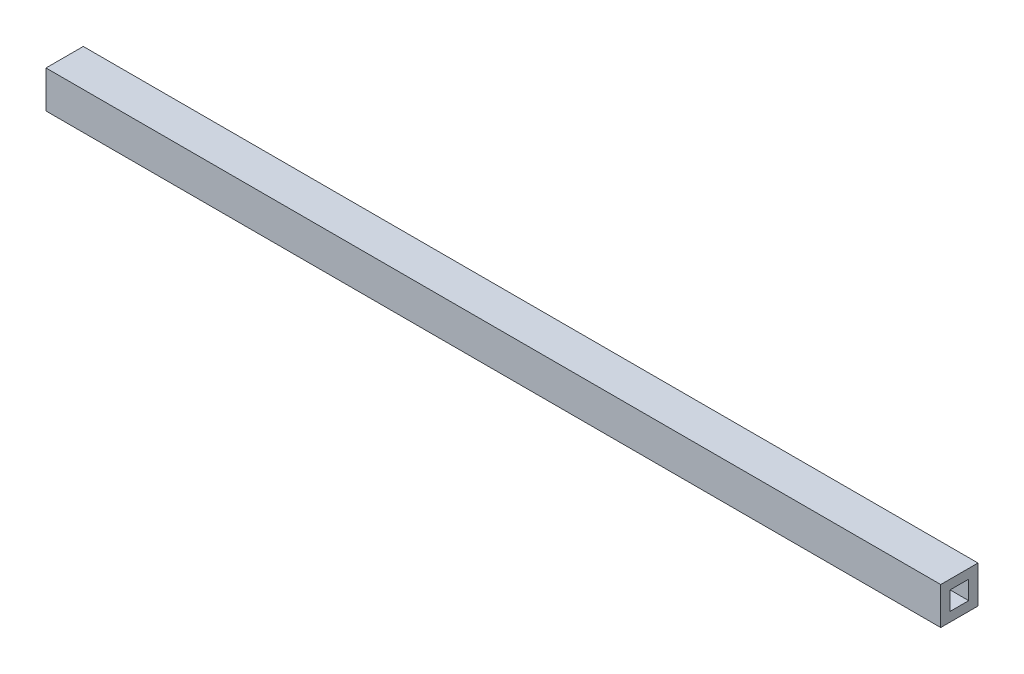
ISO-10303-21;
HEADER;
FILE_DESCRIPTION(('STEP AP214'),'2;1');
FILE_NAME('part.step','',(''),(''),'','','');
FILE_SCHEMA(('AUTOMOTIVE_DESIGN { 1 0 10303 214 1 1 1 1 }'));
ENDSEC;
DATA;
#1=APPLICATION_CONTEXT('core data for automotive mechanical design processes');
#2=APPLICATION_PROTOCOL_DEFINITION('international standard','automotive_design',2000,#1);
#3=PRODUCT_CONTEXT('',#1,'mechanical');
#4=PRODUCT('Part','Part','',(#3));
#5=PRODUCT_RELATED_PRODUCT_CATEGORY('part','',(#4));
#6=PRODUCT_DEFINITION_FORMATION('','',#4);
#7=PRODUCT_DEFINITION_CONTEXT('part definition',#1,'design');
#8=PRODUCT_DEFINITION('design','',#6,#7);
#9=PRODUCT_DEFINITION_SHAPE('','',#8);
#10=(LENGTH_UNIT() NAMED_UNIT(*) SI_UNIT(.MILLI.,.METRE.));
#11=(NAMED_UNIT(*) PLANE_ANGLE_UNIT() SI_UNIT($,.RADIAN.));
#12=(NAMED_UNIT(*) SI_UNIT($,.STERADIAN.) SOLID_ANGLE_UNIT());
#13=UNCERTAINTY_MEASURE_WITH_UNIT(LENGTH_MEASURE(1.E-05),#10,'distance_accuracy_value','');
#14=(GEOMETRIC_REPRESENTATION_CONTEXT(3) GLOBAL_UNCERTAINTY_ASSIGNED_CONTEXT((#13)) GLOBAL_UNIT_ASSIGNED_CONTEXT((#10,
#11,#12)) REPRESENTATION_CONTEXT('',''));
#15=CARTESIAN_POINT('',(0.,0.,0.));
#16=DIRECTION('',(0.,0.,1.));
#17=DIRECTION('',(1.,0.,0.));
#18=AXIS2_PLACEMENT_3D('',#15,#16,#17);
#19=CARTESIAN_POINT('',(-304.800000000001,-12.7,25.4));
#20=DIRECTION('',(1.,0.,0.));
#21=DIRECTION('',(0.,0.,-1.));
#22=AXIS2_PLACEMENT_3D('',#19,#20,#21);
#23=PLANE('',#22);
#24=DIRECTION('',(0.,0.,1.));
#25=VECTOR('',#24,1.);
#26=CARTESIAN_POINT('',(-304.800000000001,6.35,6.32894550076037));
#27=LINE('',#26,#25);
#28=CARTESIAN_POINT('',(-304.800000000001,6.35,6.32894550076037));
#29=VERTEX_POINT('',#28);
#30=CARTESIAN_POINT('',(-304.800000000001,6.35,19.0710544992396));
#31=VERTEX_POINT('',#30);
#32=EDGE_CURVE('E105',#29,#31,#27,.T.);
#33=ORIENTED_EDGE('',*,*,#32,.T.);
#34=DIRECTION('',(0.,-1.,0.));
#35=VECTOR('',#34,1.);
#36=CARTESIAN_POINT('',(-304.800000000001,-6.35,19.0710544992396));
#37=LINE('',#36,#35);
#38=CARTESIAN_POINT('',(-304.800000000001,-6.35,19.0710544992396));
#39=VERTEX_POINT('',#38);
#40=EDGE_CURVE('E99',#31,#39,#37,.T.);
#41=ORIENTED_EDGE('',*,*,#40,.T.);
#42=DIRECTION('',(0.,0.,-1.));
#43=VECTOR('',#42,1.);
#44=CARTESIAN_POINT('',(-304.800000000001,-6.35,6.32894550076037));
#45=LINE('',#44,#43);
#46=CARTESIAN_POINT('',(-304.800000000001,-6.35,6.32894550076037));
#47=VERTEX_POINT('',#46);
#48=EDGE_CURVE('E108',#39,#47,#45,.T.);
#49=ORIENTED_EDGE('',*,*,#48,.T.);
#50=DIRECTION('',(0.,1.,0.));
#51=VECTOR('',#50,1.);
#52=CARTESIAN_POINT('',(-304.800000000001,-6.35,6.32894550076037));
#53=LINE('',#52,#51);
#54=EDGE_CURVE('E47',#47,#29,#53,.T.);
#55=ORIENTED_EDGE('',*,*,#54,.T.);
#56=EDGE_LOOP('',(#33,#41,#49,#55));
#57=FACE_BOUND('',#56,.T.);
#58=DIRECTION('',(0.,-1.,0.));
#59=VECTOR('',#58,1.);
#60=CARTESIAN_POINT('',(-304.800000000001,-12.7,0.));
#61=LINE('',#60,#59);
#62=CARTESIAN_POINT('',(-304.800000000001,12.7,0.));
#63=VERTEX_POINT('',#62);
#64=CARTESIAN_POINT('',(-304.800000000001,-12.7,0.));
#65=VERTEX_POINT('',#64);
#66=EDGE_CURVE('E129',#63,#65,#61,.T.);
#67=ORIENTED_EDGE('',*,*,#66,.T.);
#68=DIRECTION('',(0.,0.,-1.));
#69=VECTOR('',#68,1.);
#70=CARTESIAN_POINT('',(-304.800000000001,-12.7,25.4));
#71=LINE('',#70,#69);
#72=CARTESIAN_POINT('',(-304.800000000001,-12.7,25.4));
#73=VERTEX_POINT('',#72);
#74=EDGE_CURVE('E11',#73,#65,#71,.T.);
#75=ORIENTED_EDGE('',*,*,#74,.F.);
#76=DIRECTION('',(0.,-1.,0.));
#77=VECTOR('',#76,1.);
#78=CARTESIAN_POINT('',(-304.800000000001,-12.7,25.4));
#79=LINE('',#78,#77);
#80=CARTESIAN_POINT('',(-304.800000000001,12.7,25.4));
#81=VERTEX_POINT('',#80);
#82=EDGE_CURVE('E133',#81,#73,#79,.T.);
#83=ORIENTED_EDGE('',*,*,#82,.F.);
#84=DIRECTION('',(0.,0.,-1.));
#85=VECTOR('',#84,1.);
#86=CARTESIAN_POINT('',(-304.800000000001,12.7,25.4));
#87=LINE('',#86,#85);
#88=EDGE_CURVE('E143',#81,#63,#87,.T.);
#89=ORIENTED_EDGE('',*,*,#88,.T.);
#90=EDGE_LOOP('',(#67,#75,#83,#89));
#91=FACE_BOUND('',#90,.T.);
#92=ADVANCED_FACE('F33',(#57,#91),#23,.F.);
#93=CARTESIAN_POINT('',(304.799999999999,-12.6999999999999,25.4));
#94=DIRECTION('',(0.,1.,0.));
#95=DIRECTION('',(-1.,0.,0.));
#96=AXIS2_PLACEMENT_3D('',#93,#94,#95);
#97=PLANE('',#96);
#98=DIRECTION('',(1.,0.,0.));
#99=VECTOR('',#98,1.);
#100=CARTESIAN_POINT('',(304.799999999999,-12.6999999999999,0.));
#101=LINE('',#100,#99);
#102=CARTESIAN_POINT('',(304.799999999999,-12.6999999999999,0.));
#103=VERTEX_POINT('',#102);
#104=EDGE_CURVE('E146',#65,#103,#101,.T.);
#105=ORIENTED_EDGE('',*,*,#104,.T.);
#106=DIRECTION('',(0.,0.,-1.));
#107=VECTOR('',#106,1.);
#108=CARTESIAN_POINT('',(304.799999999999,-12.6999999999999,25.4));
#109=LINE('',#108,#107);
#110=CARTESIAN_POINT('',(304.799999999999,-12.6999999999999,25.4));
#111=VERTEX_POINT('',#110);
#112=EDGE_CURVE('E40',#111,#103,#109,.T.);
#113=ORIENTED_EDGE('',*,*,#112,.F.);
#114=DIRECTION('',(1.,0.,0.));
#115=VECTOR('',#114,1.);
#116=CARTESIAN_POINT('',(304.799999999999,-12.6999999999999,25.4));
#117=LINE('',#116,#115);
#118=EDGE_CURVE('E136',#73,#111,#117,.T.);
#119=ORIENTED_EDGE('',*,*,#118,.F.);
#120=ORIENTED_EDGE('',*,*,#74,.T.);
#121=EDGE_LOOP('',(#105,#113,#119,#120));
#122=FACE_BOUND('',#121,.T.);
#123=ADVANCED_FACE('F175',(#122),#97,.F.);
#124=CARTESIAN_POINT('',(304.799999999999,-12.6999999999999,25.4));
#125=DIRECTION('',(-1.,0.,0.));
#126=DIRECTION('',(0.,0.,1.));
#127=AXIS2_PLACEMENT_3D('',#124,#125,#126);
#128=PLANE('',#127);
#129=DIRECTION('',(0.,0.,-1.));
#130=VECTOR('',#129,1.);
#131=CARTESIAN_POINT('',(304.799999999999,-6.35,6.32894550076037));
#132=LINE('',#131,#130);
#133=CARTESIAN_POINT('',(304.799999999999,-6.35,19.0710544992396));
#134=VERTEX_POINT('',#133);
#135=CARTESIAN_POINT('',(304.799999999999,-6.35,6.32894550076037));
#136=VERTEX_POINT('',#135);
#137=EDGE_CURVE('E123',#134,#136,#132,.T.);
#138=ORIENTED_EDGE('',*,*,#137,.F.);
#139=DIRECTION('',(0.,-1.,0.));
#140=VECTOR('',#139,1.);
#141=CARTESIAN_POINT('',(304.799999999999,-6.35,19.0710544992396));
#142=LINE('',#141,#140);
#143=CARTESIAN_POINT('',(304.799999999999,6.35,19.0710544992396));
#144=VERTEX_POINT('',#143);
#145=EDGE_CURVE('E55',#144,#134,#142,.T.);
#146=ORIENTED_EDGE('',*,*,#145,.F.);
#147=DIRECTION('',(0.,0.,1.));
#148=VECTOR('',#147,1.);
#149=CARTESIAN_POINT('',(304.799999999999,6.35,6.32894550076037));
#150=LINE('',#149,#148);
#151=CARTESIAN_POINT('',(304.799999999999,6.35,6.32894550076037));
#152=VERTEX_POINT('',#151);
#153=EDGE_CURVE('E114',#152,#144,#150,.T.);
#154=ORIENTED_EDGE('',*,*,#153,.F.);
#155=DIRECTION('',(0.,1.,0.));
#156=VECTOR('',#155,1.);
#157=CARTESIAN_POINT('',(304.799999999999,-6.35,6.32894550076037));
#158=LINE('',#157,#156);
#159=EDGE_CURVE('E117',#136,#152,#158,.T.);
#160=ORIENTED_EDGE('',*,*,#159,.F.);
#161=EDGE_LOOP('',(#138,#146,#154,#160));
#162=FACE_BOUND('',#161,.T.);
#163=DIRECTION('',(0.,1.,0.));
#164=VECTOR('',#163,1.);
#165=CARTESIAN_POINT('',(304.799999999999,-12.6999999999999,0.));
#166=LINE('',#165,#164);
#167=CARTESIAN_POINT('',(304.799999999999,12.7000000000001,0.));
#168=VERTEX_POINT('',#167);
#169=EDGE_CURVE('E148',#103,#168,#166,.T.);
#170=ORIENTED_EDGE('',*,*,#169,.T.);
#171=DIRECTION('',(0.,0.,-1.));
#172=VECTOR('',#171,1.);
#173=CARTESIAN_POINT('',(304.799999999999,12.7000000000001,25.4));
#174=LINE('',#173,#172);
#175=CARTESIAN_POINT('',(304.799999999999,12.7000000000001,25.4));
#176=VERTEX_POINT('',#175);
#177=EDGE_CURVE('E153',#176,#168,#174,.T.);
#178=ORIENTED_EDGE('',*,*,#177,.F.);
#179=DIRECTION('',(0.,1.,0.));
#180=VECTOR('',#179,1.);
#181=CARTESIAN_POINT('',(304.799999999999,-12.6999999999999,25.4));
#182=LINE('',#181,#180);
#183=EDGE_CURVE('E139',#111,#176,#182,.T.);
#184=ORIENTED_EDGE('',*,*,#183,.F.);
#185=ORIENTED_EDGE('',*,*,#112,.T.);
#186=EDGE_LOOP('',(#170,#178,#184,#185));
#187=FACE_BOUND('',#186,.T.);
#188=ADVANCED_FACE('F160',(#162,#187),#128,.F.);
#189=CARTESIAN_POINT('',(304.799999999999,12.7000000000001,25.4));
#190=DIRECTION('',(0.,-1.,0.));
#191=DIRECTION('',(1.,0.,0.));
#192=AXIS2_PLACEMENT_3D('',#189,#190,#191);
#193=PLANE('',#192);
#194=DIRECTION('',(-1.,0.,0.));
#195=VECTOR('',#194,1.);
#196=CARTESIAN_POINT('',(304.799999999999,12.7000000000001,0.));
#197=LINE('',#196,#195);
#198=EDGE_CURVE('E137',#168,#63,#197,.T.);
#199=ORIENTED_EDGE('',*,*,#198,.T.);
#200=ORIENTED_EDGE('',*,*,#88,.F.);
#201=DIRECTION('',(-1.,0.,0.));
#202=VECTOR('',#201,1.);
#203=CARTESIAN_POINT('',(304.799999999999,12.7000000000001,25.4));
#204=LINE('',#203,#202);
#205=EDGE_CURVE('E141',#176,#81,#204,.T.);
#206=ORIENTED_EDGE('',*,*,#205,.F.);
#207=ORIENTED_EDGE('',*,*,#177,.T.);
#208=EDGE_LOOP('',(#199,#200,#206,#207));
#209=FACE_BOUND('',#208,.T.);
#210=ADVANCED_FACE('F169',(#209),#193,.F.);
#211=CARTESIAN_POINT('',(0.,0.,25.4));
#212=DIRECTION('',(0.,0.,1.));
#213=DIRECTION('',(1.,0.,0.));
#214=AXIS2_PLACEMENT_3D('',#211,#212,#213);
#215=PLANE('',#214);
#216=ORIENTED_EDGE('',*,*,#82,.T.);
#217=ORIENTED_EDGE('',*,*,#118,.T.);
#218=ORIENTED_EDGE('',*,*,#183,.T.);
#219=ORIENTED_EDGE('',*,*,#205,.T.);
#220=EDGE_LOOP('',(#216,#217,#218,#219));
#221=FACE_BOUND('',#220,.T.);
#222=ADVANCED_FACE('F174',(#221),#215,.T.);
#223=CARTESIAN_POINT('',(0.,0.,0.));
#224=DIRECTION('',(0.,0.,1.));
#225=DIRECTION('',(1.,0.,0.));
#226=AXIS2_PLACEMENT_3D('',#223,#224,#225);
#227=PLANE('',#226);
#228=ORIENTED_EDGE('',*,*,#66,.F.);
#229=ORIENTED_EDGE('',*,*,#198,.F.);
#230=ORIENTED_EDGE('',*,*,#169,.F.);
#231=ORIENTED_EDGE('',*,*,#104,.F.);
#232=EDGE_LOOP('',(#228,#229,#230,#231));
#233=FACE_BOUND('',#232,.T.);
#234=ADVANCED_FACE('F166',(#233),#227,.F.);
#235=CARTESIAN_POINT('',(-304.800000000001,-6.35,19.0710544992396));
#236=DIRECTION('',(0.,0.,1.));
#237=DIRECTION('',(1.,0.,0.));
#238=AXIS2_PLACEMENT_3D('',#235,#236,#237);
#239=PLANE('',#238);
#240=ORIENTED_EDGE('',*,*,#145,.T.);
#241=DIRECTION('',(1.,0.,0.));
#242=VECTOR('',#241,1.);
#243=CARTESIAN_POINT('',(-304.800000000001,-6.35,19.0710544992396));
#244=LINE('',#243,#242);
#245=EDGE_CURVE('E95',#39,#134,#244,.T.);
#246=ORIENTED_EDGE('',*,*,#245,.F.);
#247=ORIENTED_EDGE('',*,*,#40,.F.);
#248=DIRECTION('',(1.,0.,0.));
#249=VECTOR('',#248,1.);
#250=CARTESIAN_POINT('',(-304.800000000001,6.35,19.0710544992396));
#251=LINE('',#250,#249);
#252=EDGE_CURVE('E127',#31,#144,#251,.T.);
#253=ORIENTED_EDGE('',*,*,#252,.T.);
#254=EDGE_LOOP('',(#240,#246,#247,#253));
#255=FACE_BOUND('',#254,.T.);
#256=ADVANCED_FACE('F97',(#255),#239,.F.);
#257=CARTESIAN_POINT('',(-304.800000000001,6.35,6.32894550076037));
#258=DIRECTION('',(0.,1.,0.));
#259=DIRECTION('',(0.,0.,1.));
#260=AXIS2_PLACEMENT_3D('',#257,#258,#259);
#261=PLANE('',#260);
#262=ORIENTED_EDGE('',*,*,#153,.T.);
#263=ORIENTED_EDGE('',*,*,#252,.F.);
#264=ORIENTED_EDGE('',*,*,#32,.F.);
#265=DIRECTION('',(1.,0.,0.));
#266=VECTOR('',#265,1.);
#267=CARTESIAN_POINT('',(-304.800000000001,6.35,6.32894550076037));
#268=LINE('',#267,#266);
#269=EDGE_CURVE('E130',#29,#152,#268,.T.);
#270=ORIENTED_EDGE('',*,*,#269,.T.);
#271=EDGE_LOOP('',(#262,#263,#264,#270));
#272=FACE_BOUND('',#271,.T.);
#273=ADVANCED_FACE('F192',(#272),#261,.F.);
#274=CARTESIAN_POINT('',(-304.800000000001,-6.35,6.32894550076037));
#275=DIRECTION('',(0.,0.,-1.));
#276=DIRECTION('',(-1.,0.,0.));
#277=AXIS2_PLACEMENT_3D('',#274,#275,#276);
#278=PLANE('',#277);
#279=ORIENTED_EDGE('',*,*,#159,.T.);
#280=ORIENTED_EDGE('',*,*,#269,.F.);
#281=ORIENTED_EDGE('',*,*,#54,.F.);
#282=DIRECTION('',(1.,0.,0.));
#283=VECTOR('',#282,1.);
#284=CARTESIAN_POINT('',(-304.800000000001,-6.35,6.32894550076037));
#285=LINE('',#284,#283);
#286=EDGE_CURVE('E104',#47,#136,#285,.T.);
#287=ORIENTED_EDGE('',*,*,#286,.T.);
#288=EDGE_LOOP('',(#279,#280,#281,#287));
#289=FACE_BOUND('',#288,.T.);
#290=ADVANCED_FACE('F195',(#289),#278,.F.);
#291=CARTESIAN_POINT('',(-304.800000000001,-6.35,6.32894550076037));
#292=DIRECTION('',(0.,-1.,0.));
#293=DIRECTION('',(0.,0.,-1.));
#294=AXIS2_PLACEMENT_3D('',#291,#292,#293);
#295=PLANE('',#294);
#296=ORIENTED_EDGE('',*,*,#137,.T.);
#297=ORIENTED_EDGE('',*,*,#286,.F.);
#298=ORIENTED_EDGE('',*,*,#48,.F.);
#299=ORIENTED_EDGE('',*,*,#245,.T.);
#300=EDGE_LOOP('',(#296,#297,#298,#299));
#301=FACE_BOUND('',#300,.T.);
#302=ADVANCED_FACE('F109',(#301),#295,.F.);
#303=CLOSED_SHELL('',(#92,#123,#188,#210,#222,#234,#256,#273,#290,#302));
#304=MANIFOLD_SOLID_BREP('B2',#303);
#305=ADVANCED_BREP_SHAPE_REPRESENTATION('',(#18,#304),#14);
#306=SHAPE_DEFINITION_REPRESENTATION(#9,#305);
ENDSEC;
END-ISO-10303-21;
